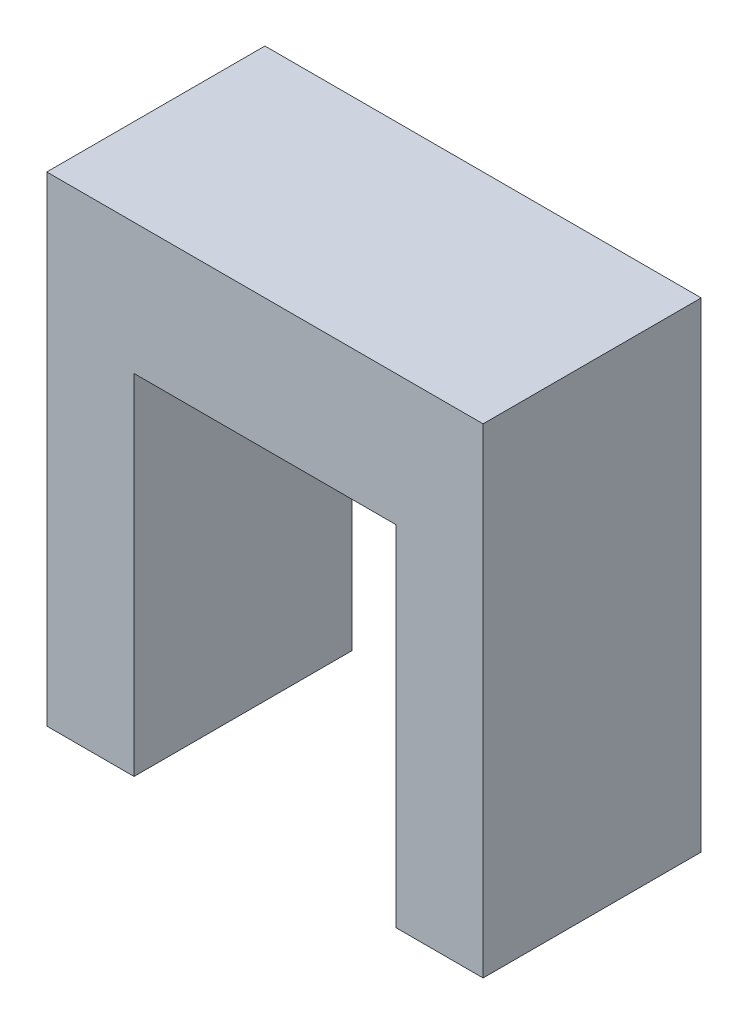
ISO-10303-21;
HEADER;
FILE_DESCRIPTION(('STEP AP214'),'2;1');
FILE_NAME('part.step','',(''),(''),'','','');
FILE_SCHEMA(('AUTOMOTIVE_DESIGN { 1 0 10303 214 1 1 1 1 }'));
ENDSEC;
DATA;
#1=APPLICATION_CONTEXT('core data for automotive mechanical design processes');
#2=APPLICATION_PROTOCOL_DEFINITION('international standard','automotive_design',2000,#1);
#3=PRODUCT_CONTEXT('',#1,'mechanical');
#4=PRODUCT('Part','Part','',(#3));
#5=PRODUCT_RELATED_PRODUCT_CATEGORY('part','',(#4));
#6=PRODUCT_DEFINITION_FORMATION('','',#4);
#7=PRODUCT_DEFINITION_CONTEXT('part definition',#1,'design');
#8=PRODUCT_DEFINITION('design','',#6,#7);
#9=PRODUCT_DEFINITION_SHAPE('','',#8);
#10=(LENGTH_UNIT() NAMED_UNIT(*) SI_UNIT(.MILLI.,.METRE.));
#11=(NAMED_UNIT(*) PLANE_ANGLE_UNIT() SI_UNIT($,.RADIAN.));
#12=(NAMED_UNIT(*) SI_UNIT($,.STERADIAN.) SOLID_ANGLE_UNIT());
#13=UNCERTAINTY_MEASURE_WITH_UNIT(LENGTH_MEASURE(1.E-05),#10,'distance_accuracy_value','');
#14=(GEOMETRIC_REPRESENTATION_CONTEXT(3) GLOBAL_UNCERTAINTY_ASSIGNED_CONTEXT((#13)) GLOBAL_UNIT_ASSIGNED_CONTEXT((#10,
#11,#12)) REPRESENTATION_CONTEXT('',''));
#15=CARTESIAN_POINT('',(0.,0.,0.));
#16=DIRECTION('',(0.,0.,1.));
#17=DIRECTION('',(1.,0.,0.));
#18=AXIS2_PLACEMENT_3D('',#15,#16,#17);
#19=CARTESIAN_POINT('',(-25.,0.,25.));
#20=DIRECTION('',(0.,1.,0.));
#21=DIRECTION('',(0.,0.,1.));
#22=AXIS2_PLACEMENT_3D('',#19,#20,#21);
#23=PLANE('',#22);
#24=DIRECTION('',(0.,0.,-1.));
#25=VECTOR('',#24,1.);
#26=CARTESIAN_POINT('',(15.,0.,25.));
#27=LINE('',#26,#25);
#28=CARTESIAN_POINT('',(15.,0.,25.));
#29=VERTEX_POINT('',#28);
#30=CARTESIAN_POINT('',(15.,0.,0.));
#31=VERTEX_POINT('',#30);
#32=EDGE_CURVE('E53',#29,#31,#27,.T.);
#33=ORIENTED_EDGE('',*,*,#32,.F.);
#34=DIRECTION('',(1.,0.,0.));
#35=VECTOR('',#34,1.);
#36=CARTESIAN_POINT('',(-25.,0.,25.));
#37=LINE('',#36,#35);
#38=CARTESIAN_POINT('',(-15.,0.,25.));
#39=VERTEX_POINT('',#38);
#40=EDGE_CURVE('E110',#39,#29,#37,.T.);
#41=ORIENTED_EDGE('',*,*,#40,.F.);
#42=DIRECTION('',(0.,0.,1.));
#43=VECTOR('',#42,1.);
#44=CARTESIAN_POINT('',(-15.,0.,25.));
#45=LINE('',#44,#43);
#46=CARTESIAN_POINT('',(-15.,0.,0.));
#47=VERTEX_POINT('',#46);
#48=EDGE_CURVE('E11',#47,#39,#45,.T.);
#49=ORIENTED_EDGE('',*,*,#48,.F.);
#50=DIRECTION('',(1.,0.,0.));
#51=VECTOR('',#50,1.);
#52=CARTESIAN_POINT('',(-25.,0.,0.));
#53=LINE('',#52,#51);
#54=EDGE_CURVE('E154',#47,#31,#53,.T.);
#55=ORIENTED_EDGE('',*,*,#54,.T.);
#56=EDGE_LOOP('',(#33,#41,#49,#55));
#57=FACE_BOUND('',#56,.T.);
#58=ADVANCED_FACE('F39',(#57),#23,.F.);
#59=CARTESIAN_POINT('',(-25.,0.,25.));
#60=DIRECTION('',(1.,0.,0.));
#61=DIRECTION('',(0.,0.,-1.));
#62=AXIS2_PLACEMENT_3D('',#59,#60,#61);
#63=PLANE('',#62);
#64=DIRECTION('',(0.,0.,-1.));
#65=VECTOR('',#64,1.);
#66=CARTESIAN_POINT('',(-25.,-40.,25.));
#67=LINE('',#66,#65);
#68=CARTESIAN_POINT('',(-25.,-40.,25.));
#69=VERTEX_POINT('',#68);
#70=CARTESIAN_POINT('',(-25.,-40.,0.));
#71=VERTEX_POINT('',#70);
#72=EDGE_CURVE('E143',#69,#71,#67,.T.);
#73=ORIENTED_EDGE('',*,*,#72,.F.);
#74=DIRECTION('',(0.,-1.,0.));
#75=VECTOR('',#74,1.);
#76=CARTESIAN_POINT('',(-25.,0.,25.));
#77=LINE('',#76,#75);
#78=CARTESIAN_POINT('',(-25.,15.,25.));
#79=VERTEX_POINT('',#78);
#80=EDGE_CURVE('E144',#79,#69,#77,.T.);
#81=ORIENTED_EDGE('',*,*,#80,.F.);
#82=DIRECTION('',(0.,0.,-1.));
#83=VECTOR('',#82,1.);
#84=CARTESIAN_POINT('',(-25.,15.,25.));
#85=LINE('',#84,#83);
#86=CARTESIAN_POINT('',(-25.,15.,0.));
#87=VERTEX_POINT('',#86);
#88=EDGE_CURVE('E153',#79,#87,#85,.T.);
#89=ORIENTED_EDGE('',*,*,#88,.T.);
#90=DIRECTION('',(0.,-1.,0.));
#91=VECTOR('',#90,1.);
#92=CARTESIAN_POINT('',(-25.,0.,0.));
#93=LINE('',#92,#91);
#94=EDGE_CURVE('E145',#87,#71,#93,.T.);
#95=ORIENTED_EDGE('',*,*,#94,.T.);
#96=EDGE_LOOP('',(#73,#81,#89,#95));
#97=FACE_BOUND('',#96,.T.);
#98=ADVANCED_FACE('F41',(#97),#63,.F.);
#99=CARTESIAN_POINT('',(25.,0.,25.));
#100=DIRECTION('',(-1.,0.,0.));
#101=DIRECTION('',(0.,0.,1.));
#102=AXIS2_PLACEMENT_3D('',#99,#100,#101);
#103=PLANE('',#102);
#104=DIRECTION('',(0.,0.,-1.));
#105=VECTOR('',#104,1.);
#106=CARTESIAN_POINT('',(25.,15.,25.));
#107=LINE('',#106,#105);
#108=CARTESIAN_POINT('',(25.,15.,25.));
#109=VERTEX_POINT('',#108);
#110=CARTESIAN_POINT('',(25.,15.,0.));
#111=VERTEX_POINT('',#110);
#112=EDGE_CURVE('E50',#109,#111,#107,.T.);
#113=ORIENTED_EDGE('',*,*,#112,.F.);
#114=DIRECTION('',(0.,1.,0.));
#115=VECTOR('',#114,1.);
#116=CARTESIAN_POINT('',(25.,0.,25.));
#117=LINE('',#116,#115);
#118=CARTESIAN_POINT('',(25.,-40.,25.));
#119=VERTEX_POINT('',#118);
#120=EDGE_CURVE('E149',#119,#109,#117,.T.);
#121=ORIENTED_EDGE('',*,*,#120,.F.);
#122=DIRECTION('',(0.,0.,-1.));
#123=VECTOR('',#122,1.);
#124=CARTESIAN_POINT('',(25.,-40.,25.));
#125=LINE('',#124,#123);
#126=CARTESIAN_POINT('',(25.,-40.,0.));
#127=VERTEX_POINT('',#126);
#128=EDGE_CURVE('E119',#119,#127,#125,.T.);
#129=ORIENTED_EDGE('',*,*,#128,.T.);
#130=DIRECTION('',(0.,1.,0.));
#131=VECTOR('',#130,1.);
#132=CARTESIAN_POINT('',(25.,0.,0.));
#133=LINE('',#132,#131);
#134=EDGE_CURVE('E160',#127,#111,#133,.T.);
#135=ORIENTED_EDGE('',*,*,#134,.T.);
#136=EDGE_LOOP('',(#113,#121,#129,#135));
#137=FACE_BOUND('',#136,.T.);
#138=ADVANCED_FACE('F188',(#137),#103,.F.);
#139=CARTESIAN_POINT('',(-25.,15.,25.));
#140=DIRECTION('',(0.,-1.,0.));
#141=DIRECTION('',(0.,0.,-1.));
#142=AXIS2_PLACEMENT_3D('',#139,#140,#141);
#143=PLANE('',#142);
#144=DIRECTION('',(-1.,0.,0.));
#145=VECTOR('',#144,1.);
#146=CARTESIAN_POINT('',(-25.,15.,0.));
#147=LINE('',#146,#145);
#148=EDGE_CURVE('E150',#111,#87,#147,.T.);
#149=ORIENTED_EDGE('',*,*,#148,.T.);
#150=ORIENTED_EDGE('',*,*,#88,.F.);
#151=DIRECTION('',(-1.,0.,0.));
#152=VECTOR('',#151,1.);
#153=CARTESIAN_POINT('',(-25.,15.,25.));
#154=LINE('',#153,#152);
#155=EDGE_CURVE('E151',#109,#79,#154,.T.);
#156=ORIENTED_EDGE('',*,*,#155,.F.);
#157=ORIENTED_EDGE('',*,*,#112,.T.);
#158=EDGE_LOOP('',(#149,#150,#156,#157));
#159=FACE_BOUND('',#158,.T.);
#160=ADVANCED_FACE('F167',(#159),#143,.F.);
#161=CARTESIAN_POINT('',(0.,0.,25.));
#162=DIRECTION('',(0.,0.,-1.));
#163=DIRECTION('',(-1.,0.,0.));
#164=AXIS2_PLACEMENT_3D('',#161,#162,#163);
#165=PLANE('',#164);
#166=ORIENTED_EDGE('',*,*,#40,.T.);
#167=DIRECTION('',(0.,-1.,0.));
#168=VECTOR('',#167,1.);
#169=CARTESIAN_POINT('',(15.,-40.,25.));
#170=LINE('',#169,#168);
#171=CARTESIAN_POINT('',(15.,-40.,25.));
#172=VERTEX_POINT('',#171);
#173=EDGE_CURVE('E101',#29,#172,#170,.T.);
#174=ORIENTED_EDGE('',*,*,#173,.T.);
#175=DIRECTION('',(1.,0.,0.));
#176=VECTOR('',#175,1.);
#177=CARTESIAN_POINT('',(15.,-40.,25.));
#178=LINE('',#177,#176);
#179=EDGE_CURVE('E102',#172,#119,#178,.T.);
#180=ORIENTED_EDGE('',*,*,#179,.T.);
#181=ORIENTED_EDGE('',*,*,#120,.T.);
#182=ORIENTED_EDGE('',*,*,#155,.T.);
#183=ORIENTED_EDGE('',*,*,#80,.T.);
#184=DIRECTION('',(1.,0.,0.));
#185=VECTOR('',#184,1.);
#186=CARTESIAN_POINT('',(-25.,-40.,25.));
#187=LINE('',#186,#185);
#188=CARTESIAN_POINT('',(-15.,-40.,25.));
#189=VERTEX_POINT('',#188);
#190=EDGE_CURVE('E128',#69,#189,#187,.T.);
#191=ORIENTED_EDGE('',*,*,#190,.T.);
#192=DIRECTION('',(0.,1.,0.));
#193=VECTOR('',#192,1.);
#194=CARTESIAN_POINT('',(-15.,-40.,25.));
#195=LINE('',#194,#193);
#196=EDGE_CURVE('E135',#189,#39,#195,.T.);
#197=ORIENTED_EDGE('',*,*,#196,.T.);
#198=EDGE_LOOP('',(#166,#174,#180,#181,#182,#183,#191,#197));
#199=FACE_BOUND('',#198,.T.);
#200=ADVANCED_FACE('F103',(#199),#165,.F.);
#201=CARTESIAN_POINT('',(0.,0.,0.));
#202=DIRECTION('',(0.,0.,-1.));
#203=DIRECTION('',(-1.,0.,0.));
#204=AXIS2_PLACEMENT_3D('',#201,#202,#203);
#205=PLANE('',#204);
#206=ORIENTED_EDGE('',*,*,#134,.F.);
#207=DIRECTION('',(1.,0.,0.));
#208=VECTOR('',#207,1.);
#209=CARTESIAN_POINT('',(15.,-40.,0.));
#210=LINE('',#209,#208);
#211=CARTESIAN_POINT('',(15.,-40.,0.));
#212=VERTEX_POINT('',#211);
#213=EDGE_CURVE('E109',#212,#127,#210,.T.);
#214=ORIENTED_EDGE('',*,*,#213,.F.);
#215=DIRECTION('',(0.,-1.,0.));
#216=VECTOR('',#215,1.);
#217=CARTESIAN_POINT('',(15.,-40.,0.));
#218=LINE('',#217,#216);
#219=EDGE_CURVE('E125',#31,#212,#218,.T.);
#220=ORIENTED_EDGE('',*,*,#219,.F.);
#221=ORIENTED_EDGE('',*,*,#54,.F.);
#222=DIRECTION('',(0.,1.,0.));
#223=VECTOR('',#222,1.);
#224=CARTESIAN_POINT('',(-15.,-40.,0.));
#225=LINE('',#224,#223);
#226=CARTESIAN_POINT('',(-15.,-40.,0.));
#227=VERTEX_POINT('',#226);
#228=EDGE_CURVE('E134',#227,#47,#225,.T.);
#229=ORIENTED_EDGE('',*,*,#228,.F.);
#230=DIRECTION('',(1.,0.,0.));
#231=VECTOR('',#230,1.);
#232=CARTESIAN_POINT('',(-25.,-40.,0.));
#233=LINE('',#232,#231);
#234=EDGE_CURVE('E123',#71,#227,#233,.T.);
#235=ORIENTED_EDGE('',*,*,#234,.F.);
#236=ORIENTED_EDGE('',*,*,#94,.F.);
#237=ORIENTED_EDGE('',*,*,#148,.F.);
#238=EDGE_LOOP('',(#206,#214,#220,#221,#229,#235,#236,#237));
#239=FACE_BOUND('',#238,.T.);
#240=ADVANCED_FACE('F172',(#239),#205,.T.);
#241=CARTESIAN_POINT('',(-15.,-40.,25.));
#242=DIRECTION('',(-1.,0.,0.));
#243=DIRECTION('',(0.,0.,1.));
#244=AXIS2_PLACEMENT_3D('',#241,#242,#243);
#245=PLANE('',#244);
#246=ORIENTED_EDGE('',*,*,#228,.T.);
#247=ORIENTED_EDGE('',*,*,#48,.T.);
#248=ORIENTED_EDGE('',*,*,#196,.F.);
#249=DIRECTION('',(0.,0.,-1.));
#250=VECTOR('',#249,1.);
#251=CARTESIAN_POINT('',(-15.,-40.,25.));
#252=LINE('',#251,#250);
#253=EDGE_CURVE('E133',#189,#227,#252,.T.);
#254=ORIENTED_EDGE('',*,*,#253,.T.);
#255=EDGE_LOOP('',(#246,#247,#248,#254));
#256=FACE_BOUND('',#255,.T.);
#257=ADVANCED_FACE('F181',(#256),#245,.F.);
#258=CARTESIAN_POINT('',(-25.,-40.,25.));
#259=DIRECTION('',(0.,1.,0.));
#260=DIRECTION('',(0.,0.,1.));
#261=AXIS2_PLACEMENT_3D('',#258,#259,#260);
#262=PLANE('',#261);
#263=ORIENTED_EDGE('',*,*,#234,.T.);
#264=ORIENTED_EDGE('',*,*,#253,.F.);
#265=ORIENTED_EDGE('',*,*,#190,.F.);
#266=ORIENTED_EDGE('',*,*,#72,.T.);
#267=EDGE_LOOP('',(#263,#264,#265,#266));
#268=FACE_BOUND('',#267,.T.);
#269=ADVANCED_FACE('F178',(#268),#262,.F.);
#270=CARTESIAN_POINT('',(15.,-40.,25.));
#271=DIRECTION('',(1.,0.,0.));
#272=DIRECTION('',(0.,0.,-1.));
#273=AXIS2_PLACEMENT_3D('',#270,#271,#272);
#274=PLANE('',#273);
#275=ORIENTED_EDGE('',*,*,#173,.F.);
#276=ORIENTED_EDGE('',*,*,#32,.T.);
#277=ORIENTED_EDGE('',*,*,#219,.T.);
#278=DIRECTION('',(0.,0.,-1.));
#279=VECTOR('',#278,1.);
#280=CARTESIAN_POINT('',(15.,-40.,25.));
#281=LINE('',#280,#279);
#282=EDGE_CURVE('E117',#172,#212,#281,.T.);
#283=ORIENTED_EDGE('',*,*,#282,.F.);
#284=EDGE_LOOP('',(#275,#276,#277,#283));
#285=FACE_BOUND('',#284,.T.);
#286=ADVANCED_FACE('F118',(#285),#274,.F.);
#287=CARTESIAN_POINT('',(15.,-40.,25.));
#288=DIRECTION('',(0.,1.,0.));
#289=DIRECTION('',(0.,0.,1.));
#290=AXIS2_PLACEMENT_3D('',#287,#288,#289);
#291=PLANE('',#290);
#292=ORIENTED_EDGE('',*,*,#213,.T.);
#293=ORIENTED_EDGE('',*,*,#128,.F.);
#294=ORIENTED_EDGE('',*,*,#179,.F.);
#295=ORIENTED_EDGE('',*,*,#282,.T.);
#296=EDGE_LOOP('',(#292,#293,#294,#295));
#297=FACE_BOUND('',#296,.T.);
#298=ADVANCED_FACE('F113',(#297),#291,.F.);
#299=CLOSED_SHELL('',(#58,#98,#138,#160,#200,#240,#257,#269,#286,#298));
#300=MANIFOLD_SOLID_BREP('B2',#299);
#301=ADVANCED_BREP_SHAPE_REPRESENTATION('',(#18,#300),#14);
#302=SHAPE_DEFINITION_REPRESENTATION(#9,#301);
ENDSEC;
END-ISO-10303-21;
